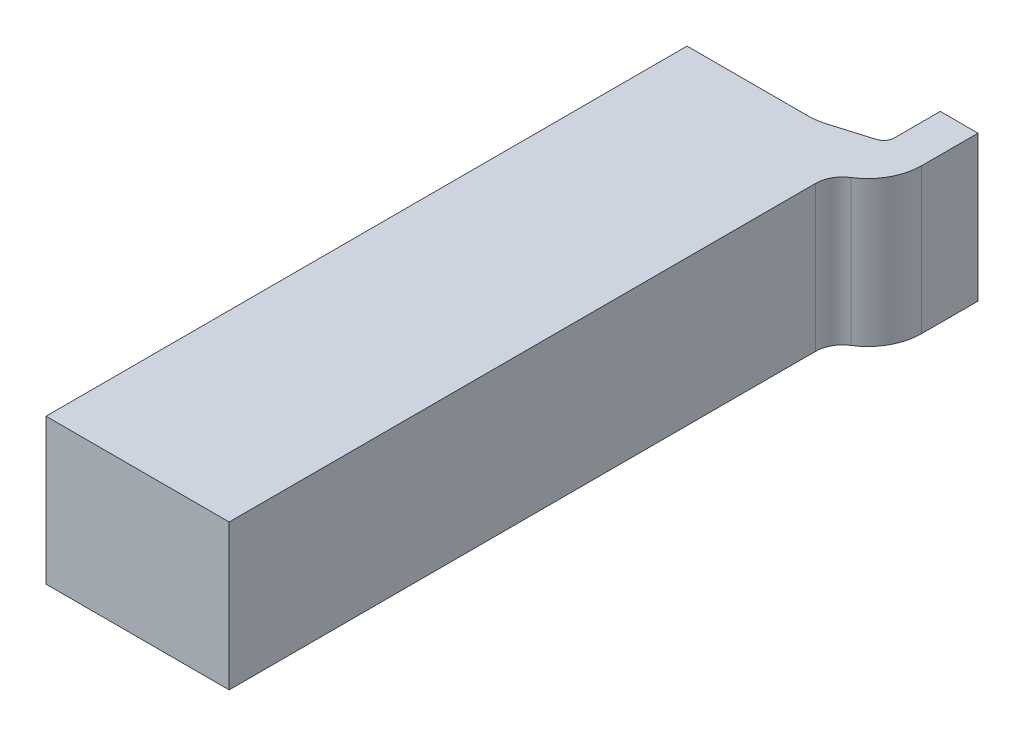
ISO-10303-21;
HEADER;
FILE_DESCRIPTION(('STEP AP214'),'2;1');
FILE_NAME('part.step','',(''),(''),'','','');
FILE_SCHEMA(('AUTOMOTIVE_DESIGN { 1 0 10303 214 1 1 1 1 }'));
ENDSEC;
DATA;
#1=APPLICATION_CONTEXT('core data for automotive mechanical design processes');
#2=APPLICATION_PROTOCOL_DEFINITION('international standard','automotive_design',2000,#1);
#3=PRODUCT_CONTEXT('',#1,'mechanical');
#4=PRODUCT('Part','Part','',(#3));
#5=PRODUCT_RELATED_PRODUCT_CATEGORY('part','',(#4));
#6=PRODUCT_DEFINITION_FORMATION('','',#4);
#7=PRODUCT_DEFINITION_CONTEXT('part definition',#1,'design');
#8=PRODUCT_DEFINITION('design','',#6,#7);
#9=PRODUCT_DEFINITION_SHAPE('','',#8);
#10=(LENGTH_UNIT() NAMED_UNIT(*) SI_UNIT(.MILLI.,.METRE.));
#11=(NAMED_UNIT(*) PLANE_ANGLE_UNIT() SI_UNIT($,.RADIAN.));
#12=(NAMED_UNIT(*) SI_UNIT($,.STERADIAN.) SOLID_ANGLE_UNIT());
#13=UNCERTAINTY_MEASURE_WITH_UNIT(LENGTH_MEASURE(1.E-05),#10,'distance_accuracy_value','');
#14=(GEOMETRIC_REPRESENTATION_CONTEXT(3) GLOBAL_UNCERTAINTY_ASSIGNED_CONTEXT((#13)) GLOBAL_UNIT_ASSIGNED_CONTEXT((#10,
#11,#12)) REPRESENTATION_CONTEXT('',''));
#15=CARTESIAN_POINT('',(0.,0.,0.));
#16=DIRECTION('',(0.,0.,1.));
#17=DIRECTION('',(1.,0.,0.));
#18=AXIS2_PLACEMENT_3D('',#15,#16,#17);
#19=CARTESIAN_POINT('',(-17.,-13.5,-59.5));
#20=DIRECTION('',(-1.,0.,0.));
#21=DIRECTION('',(0.,0.,1.));
#22=AXIS2_PLACEMENT_3D('',#19,#20,#21);
#23=PLANE('',#22);
#24=DIRECTION('',(0.,1.,0.));
#25=VECTOR('',#24,1.);
#26=CARTESIAN_POINT('',(-17.,-13.5,59.5));
#27=LINE('',#26,#25);
#28=CARTESIAN_POINT('',(-17.,-13.5,59.5));
#29=VERTEX_POINT('',#28);
#30=CARTESIAN_POINT('',(-17.,13.5,59.5));
#31=VERTEX_POINT('',#30);
#32=EDGE_CURVE('E182',#29,#31,#27,.T.);
#33=ORIENTED_EDGE('',*,*,#32,.T.);
#34=DIRECTION('',(0.,0.,1.));
#35=VECTOR('',#34,1.);
#36=CARTESIAN_POINT('',(-17.,13.5,-59.5));
#37=LINE('',#36,#35);
#38=CARTESIAN_POINT('',(-17.,13.5,-59.5));
#39=VERTEX_POINT('',#38);
#40=EDGE_CURVE('E146',#39,#31,#37,.T.);
#41=ORIENTED_EDGE('',*,*,#40,.F.);
#42=DIRECTION('',(0.,1.,0.));
#43=VECTOR('',#42,1.);
#44=CARTESIAN_POINT('',(-17.,-13.5,-59.5));
#45=LINE('',#44,#43);
#46=CARTESIAN_POINT('',(-17.,-13.5,-59.5));
#47=VERTEX_POINT('',#46);
#48=EDGE_CURVE('E183',#47,#39,#45,.T.);
#49=ORIENTED_EDGE('',*,*,#48,.F.);
#50=DIRECTION('',(0.,0.,1.));
#51=VECTOR('',#50,1.);
#52=CARTESIAN_POINT('',(-17.,-13.5,-59.5));
#53=LINE('',#52,#51);
#54=EDGE_CURVE('E171',#47,#29,#53,.T.);
#55=ORIENTED_EDGE('',*,*,#54,.T.);
#56=EDGE_LOOP('',(#33,#41,#49,#55));
#57=FACE_BOUND('',#56,.T.);
#58=ADVANCED_FACE('F38',(#57),#23,.T.);
#59=CARTESIAN_POINT('',(-17.,-13.5,-59.5));
#60=DIRECTION('',(0.,0.,-1.));
#61=DIRECTION('',(-1.,0.,0.));
#62=AXIS2_PLACEMENT_3D('',#59,#60,#61);
#63=PLANE('',#62);
#64=DIRECTION('',(-1.,0.,0.));
#65=VECTOR('',#64,1.);
#66=CARTESIAN_POINT('',(-17.,13.5,-59.5));
#67=LINE('',#66,#65);
#68=CARTESIAN_POINT('',(5.53231163696492,13.5,-59.5));
#69=VERTEX_POINT('',#68);
#70=EDGE_CURVE('E169',#69,#39,#67,.T.);
#71=ORIENTED_EDGE('',*,*,#70,.F.);
#72=DIRECTION('',(0.,-1.,0.));
#73=VECTOR('',#72,1.);
#74=CARTESIAN_POINT('',(5.53231163696492,-13.5,-59.5));
#75=LINE('',#74,#73);
#76=CARTESIAN_POINT('',(5.53231163696492,-13.5,-59.5));
#77=VERTEX_POINT('',#76);
#78=EDGE_CURVE('E193',#69,#77,#75,.T.);
#79=ORIENTED_EDGE('',*,*,#78,.T.);
#80=DIRECTION('',(-1.,0.,0.));
#81=VECTOR('',#80,1.);
#82=CARTESIAN_POINT('',(-17.,-13.5,-59.5));
#83=LINE('',#82,#81);
#84=EDGE_CURVE('E180',#77,#47,#83,.T.);
#85=ORIENTED_EDGE('',*,*,#84,.T.);
#86=ORIENTED_EDGE('',*,*,#48,.T.);
#87=EDGE_LOOP('',(#71,#79,#85,#86));
#88=FACE_BOUND('',#87,.T.);
#89=ADVANCED_FACE('F250',(#88),#63,.T.);
#90=CARTESIAN_POINT('',(17.,-13.5,-59.5));
#91=DIRECTION('',(1.,0.,0.));
#92=DIRECTION('',(0.,0.,-1.));
#93=AXIS2_PLACEMENT_3D('',#90,#91,#92);
#94=PLANE('',#93);
#95=DIRECTION('',(0.,0.,-1.));
#96=VECTOR('',#95,1.);
#97=CARTESIAN_POINT('',(17.,-13.5,-59.5));
#98=LINE('',#97,#96);
#99=CARTESIAN_POINT('',(17.,-13.5,59.5));
#100=VERTEX_POINT('',#99);
#101=CARTESIAN_POINT('',(17.,-13.5,-49.3508144737199));
#102=VERTEX_POINT('',#101);
#103=EDGE_CURVE('E177',#100,#102,#98,.T.);
#104=ORIENTED_EDGE('',*,*,#103,.T.);
#105=DIRECTION('',(0.,1.,0.));
#106=VECTOR('',#105,1.);
#107=CARTESIAN_POINT('',(17.,13.5,-49.3508144737199));
#108=LINE('',#107,#106);
#109=CARTESIAN_POINT('',(17.,13.5,-49.3508144737199));
#110=VERTEX_POINT('',#109);
#111=EDGE_CURVE('E211',#102,#110,#108,.T.);
#112=ORIENTED_EDGE('',*,*,#111,.T.);
#113=DIRECTION('',(0.,0.,-1.));
#114=VECTOR('',#113,1.);
#115=CARTESIAN_POINT('',(17.,13.5,-59.5));
#116=LINE('',#115,#114);
#117=CARTESIAN_POINT('',(17.,13.5,59.5));
#118=VERTEX_POINT('',#117);
#119=EDGE_CURVE('E166',#118,#110,#116,.T.);
#120=ORIENTED_EDGE('',*,*,#119,.F.);
#121=DIRECTION('',(0.,1.,0.));
#122=VECTOR('',#121,1.);
#123=CARTESIAN_POINT('',(17.,-13.5,59.5));
#124=LINE('',#123,#122);
#125=EDGE_CURVE('E187',#100,#118,#124,.T.);
#126=ORIENTED_EDGE('',*,*,#125,.F.);
#127=EDGE_LOOP('',(#104,#112,#120,#126));
#128=FACE_BOUND('',#127,.T.);
#129=ADVANCED_FACE('F236',(#128),#94,.T.);
#130=CARTESIAN_POINT('',(-17.,-13.5,59.5));
#131=DIRECTION('',(0.,0.,1.));
#132=DIRECTION('',(1.,0.,0.));
#133=AXIS2_PLACEMENT_3D('',#130,#131,#132);
#134=PLANE('',#133);
#135=ORIENTED_EDGE('',*,*,#125,.T.);
#136=DIRECTION('',(1.,0.,0.));
#137=VECTOR('',#136,1.);
#138=CARTESIAN_POINT('',(-17.,13.5,59.5));
#139=LINE('',#138,#137);
#140=EDGE_CURVE('E163',#31,#118,#139,.T.);
#141=ORIENTED_EDGE('',*,*,#140,.F.);
#142=ORIENTED_EDGE('',*,*,#32,.F.);
#143=DIRECTION('',(1.,0.,0.));
#144=VECTOR('',#143,1.);
#145=CARTESIAN_POINT('',(-17.,-13.5,59.5));
#146=LINE('',#145,#144);
#147=EDGE_CURVE('E174',#29,#100,#146,.T.);
#148=ORIENTED_EDGE('',*,*,#147,.T.);
#149=EDGE_LOOP('',(#135,#141,#142,#148));
#150=FACE_BOUND('',#149,.T.);
#151=ADVANCED_FACE('F243',(#150),#134,.T.);
#152=CARTESIAN_POINT('',(0.,-13.5,0.));
#153=DIRECTION('',(0.,1.,0.));
#154=DIRECTION('',(0.,0.,1.));
#155=AXIS2_PLACEMENT_3D('',#152,#153,#154);
#156=PLANE('',#155);
#157=DIRECTION('',(0.,0.,-1.));
#158=VECTOR('',#157,1.);
#159=CARTESIAN_POINT('',(24.,-13.5,-52.5));
#160=LINE('',#159,#158);
#161=CARTESIAN_POINT('',(24.,-13.5,-62.0393920141695));
#162=VERTEX_POINT('',#161);
#163=CARTESIAN_POINT('',(24.,-13.5,-72.5));
#164=VERTEX_POINT('',#163);
#165=EDGE_CURVE('E126',#162,#164,#160,.T.);
#166=ORIENTED_EDGE('',*,*,#165,.F.);
#167=CARTESIAN_POINT('',(14.,-13.5,-62.0393920141695));
#168=DIRECTION('',(0.,1.,0.));
#169=DIRECTION('',(0.,0.,1.));
#170=AXIS2_PLACEMENT_3D('',#167,#168,#169);
#171=CIRCLE('',#170,10.);
#172=CARTESIAN_POINT('',(19.3333333333333,-13.5,-53.5803403205365));
#173=VERTEX_POINT('',#172);
#174=EDGE_CURVE('E200',#162,#173,#171,.F.);
#175=ORIENTED_EDGE('',*,*,#174,.T.);
#176=CARTESIAN_POINT('',(22.,-13.5,-49.3508144737199));
#177=DIRECTION('',(0.,1.,0.));
#178=DIRECTION('',(0.,0.,1.));
#179=AXIS2_PLACEMENT_3D('',#176,#177,#178);
#180=CIRCLE('',#179,5.);
#181=EDGE_CURVE('E213',#173,#102,#180,.T.);
#182=ORIENTED_EDGE('',*,*,#181,.T.);
#183=ORIENTED_EDGE('',*,*,#103,.F.);
#184=ORIENTED_EDGE('',*,*,#147,.F.);
#185=ORIENTED_EDGE('',*,*,#54,.F.);
#186=ORIENTED_EDGE('',*,*,#84,.F.);
#187=CARTESIAN_POINT('',(5.53231163696492,-13.5,-69.5));
#188=DIRECTION('',(0.,1.,0.));
#189=DIRECTION('',(0.,0.,1.));
#190=AXIS2_PLACEMENT_3D('',#187,#188,#189);
#191=CIRCLE('',#190,10.);
#192=CARTESIAN_POINT('',(8.40579049262841,-13.5,-59.9217371477885));
#193=VERTEX_POINT('',#192);
#194=EDGE_CURVE('E204',#77,#193,#191,.T.);
#195=ORIENTED_EDGE('',*,*,#194,.T.);
#196=DIRECTION('',(0.957826285221151,0.,-0.287347885566348));
#197=VECTOR('',#196,1.);
#198=CARTESIAN_POINT('',(-15.7981651376148,-13.5,-52.6605504587154));
#199=LINE('',#198,#197);
#200=CARTESIAN_POINT('',(15.5746957711327,-13.5,-62.0724087313398));
#201=VERTEX_POINT('',#200);
#202=EDGE_CURVE('E191',#193,#201,#199,.T.);
#203=ORIENTED_EDGE('',*,*,#202,.T.);
#204=CARTESIAN_POINT('',(15.,-13.5,-63.9880613017821));
#205=DIRECTION('',(0.,1.,0.));
#206=DIRECTION('',(0.,0.,1.));
#207=AXIS2_PLACEMENT_3D('',#204,#205,#206);
#208=CIRCLE('',#207,2.);
#209=CARTESIAN_POINT('',(17.,-13.5,-63.9880613017821));
#210=VERTEX_POINT('',#209);
#211=EDGE_CURVE('E11',#201,#210,#208,.T.);
#212=ORIENTED_EDGE('',*,*,#211,.T.);
#213=DIRECTION('',(0.,0.,-1.));
#214=VECTOR('',#213,1.);
#215=CARTESIAN_POINT('',(17.,-13.5,-52.5));
#216=LINE('',#215,#214);
#217=CARTESIAN_POINT('',(17.,-13.5,-72.5));
#218=VERTEX_POINT('',#217);
#219=EDGE_CURVE('E143',#210,#218,#216,.T.);
#220=ORIENTED_EDGE('',*,*,#219,.T.);
#221=DIRECTION('',(-1.,0.,0.));
#222=VECTOR('',#221,1.);
#223=CARTESIAN_POINT('',(24.,-13.5,-72.5));
#224=LINE('',#223,#222);
#225=EDGE_CURVE('E140',#164,#218,#224,.T.);
#226=ORIENTED_EDGE('',*,*,#225,.F.);
#227=EDGE_LOOP('',(#166,#175,#182,#183,#184,#185,#186,#195,#203,#212,#220,#226));
#228=FACE_BOUND('',#227,.T.);
#229=ADVANCED_FACE('F141',(#228),#156,.F.);
#230=CARTESIAN_POINT('',(0.,13.5,0.));
#231=DIRECTION('',(0.,1.,0.));
#232=DIRECTION('',(0.,0.,1.));
#233=AXIS2_PLACEMENT_3D('',#230,#231,#232);
#234=PLANE('',#233);
#235=ORIENTED_EDGE('',*,*,#119,.T.);
#236=CARTESIAN_POINT('',(22.,13.5,-49.3508144737199));
#237=DIRECTION('',(0.,1.,0.));
#238=DIRECTION('',(0.,0.,1.));
#239=AXIS2_PLACEMENT_3D('',#236,#237,#238);
#240=CIRCLE('',#239,5.);
#241=CARTESIAN_POINT('',(19.3333333333333,13.5,-53.5803403205364));
#242=VERTEX_POINT('',#241);
#243=EDGE_CURVE('E215',#110,#242,#240,.F.);
#244=ORIENTED_EDGE('',*,*,#243,.T.);
#245=CARTESIAN_POINT('',(14.,13.5,-62.0393920141695));
#246=DIRECTION('',(0.,1.,0.));
#247=DIRECTION('',(0.,0.,1.));
#248=AXIS2_PLACEMENT_3D('',#245,#246,#247);
#249=CIRCLE('',#248,10.);
#250=CARTESIAN_POINT('',(24.,13.5,-62.0393920141695));
#251=VERTEX_POINT('',#250);
#252=EDGE_CURVE('E202',#242,#251,#249,.T.);
#253=ORIENTED_EDGE('',*,*,#252,.T.);
#254=DIRECTION('',(0.,0.,1.));
#255=VECTOR('',#254,1.);
#256=CARTESIAN_POINT('',(24.,13.5,-52.5));
#257=LINE('',#256,#255);
#258=CARTESIAN_POINT('',(24.,13.5,-72.5));
#259=VERTEX_POINT('',#258);
#260=EDGE_CURVE('E152',#259,#251,#257,.T.);
#261=ORIENTED_EDGE('',*,*,#260,.F.);
#262=DIRECTION('',(-1.,0.,0.));
#263=VECTOR('',#262,1.);
#264=CARTESIAN_POINT('',(24.,13.5,-72.5));
#265=LINE('',#264,#263);
#266=CARTESIAN_POINT('',(17.,13.5,-72.5));
#267=VERTEX_POINT('',#266);
#268=EDGE_CURVE('E147',#259,#267,#265,.T.);
#269=ORIENTED_EDGE('',*,*,#268,.T.);
#270=DIRECTION('',(0.,0.,1.));
#271=VECTOR('',#270,1.);
#272=CARTESIAN_POINT('',(17.,13.5,-52.5));
#273=LINE('',#272,#271);
#274=CARTESIAN_POINT('',(17.,13.5,-63.9880613017821));
#275=VERTEX_POINT('',#274);
#276=EDGE_CURVE('E137',#267,#275,#273,.T.);
#277=ORIENTED_EDGE('',*,*,#276,.T.);
#278=CARTESIAN_POINT('',(15.,13.5,-63.9880613017821));
#279=DIRECTION('',(0.,1.,0.));
#280=DIRECTION('',(0.,0.,1.));
#281=AXIS2_PLACEMENT_3D('',#278,#279,#280);
#282=CIRCLE('',#281,2.);
#283=CARTESIAN_POINT('',(15.5746957711327,13.5,-62.0724087313398));
#284=VERTEX_POINT('',#283);
#285=EDGE_CURVE('E46',#275,#284,#282,.F.);
#286=ORIENTED_EDGE('',*,*,#285,.T.);
#287=DIRECTION('',(-0.957826285221151,0.,0.287347885566348));
#288=VECTOR('',#287,1.);
#289=CARTESIAN_POINT('',(17.,13.5,-62.5));
#290=LINE('',#289,#288);
#291=CARTESIAN_POINT('',(8.4057904926284,13.5,-59.9217371477885));
#292=VERTEX_POINT('',#291);
#293=EDGE_CURVE('E186',#284,#292,#290,.T.);
#294=ORIENTED_EDGE('',*,*,#293,.T.);
#295=CARTESIAN_POINT('',(5.53231163696492,13.5,-69.5));
#296=DIRECTION('',(0.,1.,0.));
#297=DIRECTION('',(0.,0.,1.));
#298=AXIS2_PLACEMENT_3D('',#295,#296,#297);
#299=CIRCLE('',#298,10.);
#300=EDGE_CURVE('E206',#292,#69,#299,.F.);
#301=ORIENTED_EDGE('',*,*,#300,.T.);
#302=ORIENTED_EDGE('',*,*,#70,.T.);
#303=ORIENTED_EDGE('',*,*,#40,.T.);
#304=ORIENTED_EDGE('',*,*,#140,.T.);
#305=EDGE_LOOP('',(#235,#244,#253,#261,#269,#277,#286,#294,#301,#302,#303,#304));
#306=FACE_BOUND('',#305,.T.);
#307=ADVANCED_FACE('F226',(#306),#234,.T.);
#308=CARTESIAN_POINT('',(17.,0.,0.));
#309=DIRECTION('',(1.,0.,0.));
#310=DIRECTION('',(0.,0.,-1.));
#311=AXIS2_PLACEMENT_3D('',#308,#309,#310);
#312=PLANE('',#311);
#313=ORIENTED_EDGE('',*,*,#219,.F.);
#314=DIRECTION('',(0.,1.,0.));
#315=VECTOR('',#314,1.);
#316=CARTESIAN_POINT('',(17.,13.5,-63.9880613017821));
#317=LINE('',#316,#315);
#318=EDGE_CURVE('E217',#210,#275,#317,.T.);
#319=ORIENTED_EDGE('',*,*,#318,.T.);
#320=ORIENTED_EDGE('',*,*,#276,.F.);
#321=DIRECTION('',(0.,1.,0.));
#322=VECTOR('',#321,1.);
#323=CARTESIAN_POINT('',(17.,13.5,-72.5));
#324=LINE('',#323,#322);
#325=EDGE_CURVE('E157',#218,#267,#324,.T.);
#326=ORIENTED_EDGE('',*,*,#325,.F.);
#327=EDGE_LOOP('',(#313,#319,#320,#326));
#328=FACE_BOUND('',#327,.T.);
#329=ADVANCED_FACE('F223',(#328),#312,.F.);
#330=CARTESIAN_POINT('',(24.,13.5,-72.5));
#331=DIRECTION('',(0.,0.,1.));
#332=DIRECTION('',(0.,-1.,0.));
#333=AXIS2_PLACEMENT_3D('',#330,#331,#332);
#334=PLANE('',#333);
#335=ORIENTED_EDGE('',*,*,#325,.T.);
#336=ORIENTED_EDGE('',*,*,#268,.F.);
#337=DIRECTION('',(0.,1.,0.));
#338=VECTOR('',#337,1.);
#339=CARTESIAN_POINT('',(24.,13.5,-72.5));
#340=LINE('',#339,#338);
#341=EDGE_CURVE('E131',#164,#259,#340,.T.);
#342=ORIENTED_EDGE('',*,*,#341,.F.);
#343=ORIENTED_EDGE('',*,*,#225,.T.);
#344=EDGE_LOOP('',(#335,#336,#342,#343));
#345=FACE_BOUND('',#344,.T.);
#346=ADVANCED_FACE('F149',(#345),#334,.F.);
#347=CARTESIAN_POINT('',(24.,0.,0.));
#348=DIRECTION('',(1.,0.,0.));
#349=DIRECTION('',(0.,0.,-1.));
#350=AXIS2_PLACEMENT_3D('',#347,#348,#349);
#351=PLANE('',#350);
#352=ORIENTED_EDGE('',*,*,#260,.T.);
#353=DIRECTION('',(0.,1.,0.));
#354=VECTOR('',#353,1.);
#355=CARTESIAN_POINT('',(24.,-13.5,-62.0393920141695));
#356=LINE('',#355,#354);
#357=EDGE_CURVE('E134',#251,#162,#356,.F.);
#358=ORIENTED_EDGE('',*,*,#357,.T.);
#359=ORIENTED_EDGE('',*,*,#165,.T.);
#360=ORIENTED_EDGE('',*,*,#341,.T.);
#361=EDGE_LOOP('',(#352,#358,#359,#360));
#362=FACE_BOUND('',#361,.T.);
#363=ADVANCED_FACE('F129',(#362),#351,.T.);
#364=CARTESIAN_POINT('',(17.,0.,-62.5));
#365=DIRECTION('',(0.287347885566348,0.,0.957826285221151));
#366=DIRECTION('',(0.,1.,0.));
#367=AXIS2_PLACEMENT_3D('',#364,#365,#366);
#368=PLANE('',#367);
#369=ORIENTED_EDGE('',*,*,#293,.F.);
#370=DIRECTION('',(0.,1.,0.));
#371=VECTOR('',#370,1.);
#372=CARTESIAN_POINT('',(15.5746957711327,-13.5,-62.0724087313398));
#373=LINE('',#372,#371);
#374=EDGE_CURVE('E59',#284,#201,#373,.F.);
#375=ORIENTED_EDGE('',*,*,#374,.T.);
#376=ORIENTED_EDGE('',*,*,#202,.F.);
#377=DIRECTION('',(0.,-1.,0.));
#378=VECTOR('',#377,1.);
#379=CARTESIAN_POINT('',(8.4057904926284,0.,-59.9217371477885));
#380=LINE('',#379,#378);
#381=EDGE_CURVE('E196',#193,#292,#380,.F.);
#382=ORIENTED_EDGE('',*,*,#381,.T.);
#383=EDGE_LOOP('',(#369,#375,#376,#382));
#384=FACE_BOUND('',#383,.T.);
#385=ADVANCED_FACE('F254',(#384),#368,.F.);
#386=CARTESIAN_POINT('',(5.53231163696492,-13.5,-69.5));
#387=DIRECTION('',(0.,-1.,0.));
#388=DIRECTION('',(0.,0.,-1.));
#389=AXIS2_PLACEMENT_3D('',#386,#387,#388);
#390=CYLINDRICAL_SURFACE('',#389,10.);
#391=ORIENTED_EDGE('',*,*,#300,.F.);
#392=ORIENTED_EDGE('',*,*,#381,.F.);
#393=ORIENTED_EDGE('',*,*,#194,.F.);
#394=ORIENTED_EDGE('',*,*,#78,.F.);
#395=EDGE_LOOP('',(#391,#392,#393,#394));
#396=FACE_BOUND('',#395,.T.);
#397=ADVANCED_FACE('F256',(#396),#390,.F.);
#398=CARTESIAN_POINT('',(14.,13.5,-62.0393920141695));
#399=DIRECTION('',(0.,-1.,0.));
#400=DIRECTION('',(0.,0.,-1.));
#401=AXIS2_PLACEMENT_3D('',#398,#399,#400);
#402=CYLINDRICAL_SURFACE('',#401,10.);
#403=ORIENTED_EDGE('',*,*,#252,.F.);
#404=DIRECTION('',(0.,-1.,0.));
#405=VECTOR('',#404,1.);
#406=CARTESIAN_POINT('',(19.3333333333333,13.5,-53.5803403205364));
#407=LINE('',#406,#405);
#408=EDGE_CURVE('E208',#242,#173,#407,.T.);
#409=ORIENTED_EDGE('',*,*,#408,.T.);
#410=ORIENTED_EDGE('',*,*,#174,.F.);
#411=ORIENTED_EDGE('',*,*,#357,.F.);
#412=EDGE_LOOP('',(#403,#409,#410,#411));
#413=FACE_BOUND('',#412,.T.);
#414=ADVANCED_FACE('F229',(#413),#402,.T.);
#415=CARTESIAN_POINT('',(22.,13.5,-49.3508144737199));
#416=DIRECTION('',(0.,-1.,0.));
#417=DIRECTION('',(0.,0.,-1.));
#418=AXIS2_PLACEMENT_3D('',#415,#416,#417);
#419=CYLINDRICAL_SURFACE('',#418,5.);
#420=ORIENTED_EDGE('',*,*,#243,.F.);
#421=ORIENTED_EDGE('',*,*,#111,.F.);
#422=ORIENTED_EDGE('',*,*,#181,.F.);
#423=ORIENTED_EDGE('',*,*,#408,.F.);
#424=EDGE_LOOP('',(#420,#421,#422,#423));
#425=FACE_BOUND('',#424,.T.);
#426=ADVANCED_FACE('F239',(#425),#419,.F.);
#427=CARTESIAN_POINT('',(15.,0.,-63.9880613017821));
#428=DIRECTION('',(0.,-1.,0.));
#429=DIRECTION('',(0.,0.,-1.));
#430=AXIS2_PLACEMENT_3D('',#427,#428,#429);
#431=CYLINDRICAL_SURFACE('',#430,2.);
#432=ORIENTED_EDGE('',*,*,#211,.F.);
#433=ORIENTED_EDGE('',*,*,#374,.F.);
#434=ORIENTED_EDGE('',*,*,#285,.F.);
#435=ORIENTED_EDGE('',*,*,#318,.F.);
#436=EDGE_LOOP('',(#432,#433,#434,#435));
#437=FACE_BOUND('',#436,.T.);
#438=ADVANCED_FACE('F40',(#437),#431,.F.);
#439=CLOSED_SHELL('',(#58,#89,#129,#151,#229,#307,#329,#346,#363,#385,#397,#414,#426,#438));
#440=MANIFOLD_SOLID_BREP('B2',#439);
#441=ADVANCED_BREP_SHAPE_REPRESENTATION('',(#18,#440),#14);
#442=SHAPE_DEFINITION_REPRESENTATION(#9,#441);
ENDSEC;
END-ISO-10303-21;
